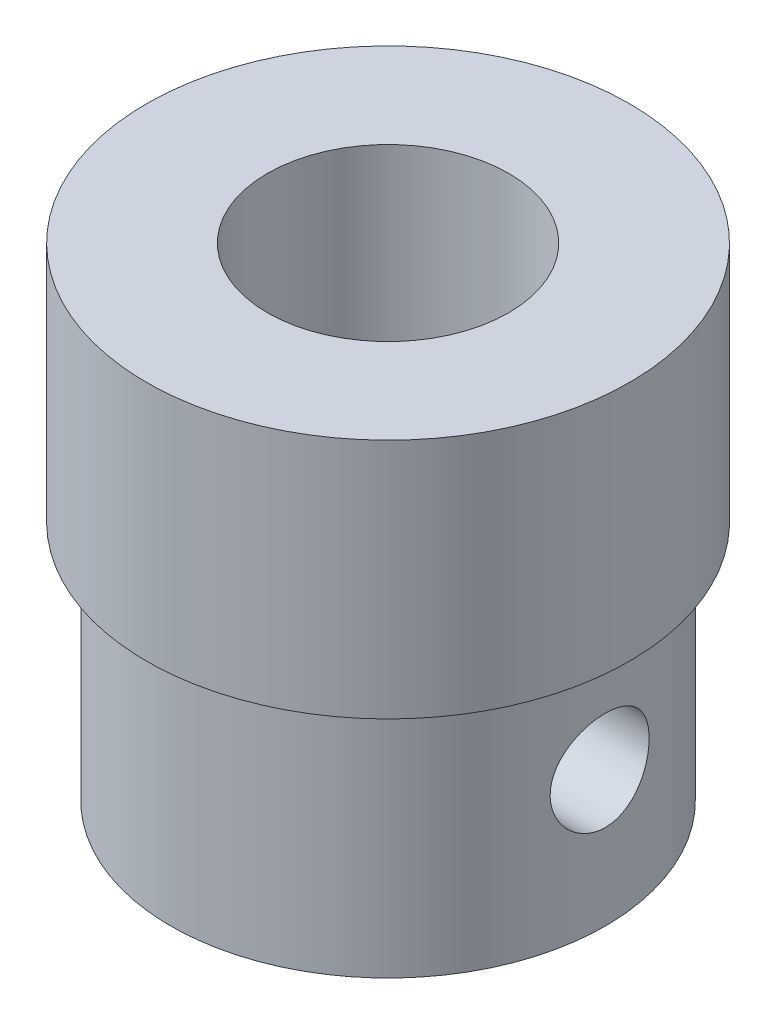
ISO-10303-21;
HEADER;
FILE_DESCRIPTION(('STEP AP214'),'2;1');
FILE_NAME('part.step','',(''),(''),'','','');
FILE_SCHEMA(('AUTOMOTIVE_DESIGN { 1 0 10303 214 1 1 1 1 }'));
ENDSEC;
DATA;
#1=APPLICATION_CONTEXT('core data for automotive mechanical design processes');
#2=APPLICATION_PROTOCOL_DEFINITION('international standard','automotive_design',2000,#1);
#3=PRODUCT_CONTEXT('',#1,'mechanical');
#4=PRODUCT('Part','Part','',(#3));
#5=PRODUCT_RELATED_PRODUCT_CATEGORY('part','',(#4));
#6=PRODUCT_DEFINITION_FORMATION('','',#4);
#7=PRODUCT_DEFINITION_CONTEXT('part definition',#1,'design');
#8=PRODUCT_DEFINITION('design','',#6,#7);
#9=PRODUCT_DEFINITION_SHAPE('','',#8);
#10=(LENGTH_UNIT() NAMED_UNIT(*) SI_UNIT(.MILLI.,.METRE.));
#11=(NAMED_UNIT(*) PLANE_ANGLE_UNIT() SI_UNIT($,.RADIAN.));
#12=(NAMED_UNIT(*) SI_UNIT($,.STERADIAN.) SOLID_ANGLE_UNIT());
#13=UNCERTAINTY_MEASURE_WITH_UNIT(LENGTH_MEASURE(1.E-05),#10,'distance_accuracy_value','');
#14=(GEOMETRIC_REPRESENTATION_CONTEXT(3) GLOBAL_UNCERTAINTY_ASSIGNED_CONTEXT((#13)) GLOBAL_UNIT_ASSIGNED_CONTEXT((#10,
#11,#12)) REPRESENTATION_CONTEXT('',''));
#15=CARTESIAN_POINT('',(0.,0.,0.));
#16=DIRECTION('',(0.,0.,1.));
#17=DIRECTION('',(1.,0.,0.));
#18=AXIS2_PLACEMENT_3D('',#15,#16,#17);
#19=CARTESIAN_POINT('',(0.,5.,-5.));
#20=DIRECTION('',(0.,-1.,0.));
#21=DIRECTION('',(0.,0.,-1.));
#22=AXIS2_PLACEMENT_3D('',#19,#20,#21);
#23=PLANE('',#22);
#24=CARTESIAN_POINT('',(0.,5.,0.));
#25=DIRECTION('',(0.,-1.,0.));
#26=DIRECTION('',(0.,0.,-1.));
#27=AXIS2_PLACEMENT_3D('',#24,#25,#26);
#28=CIRCLE('',#27,4.5);
#29=CARTESIAN_POINT('',(0.,5.,-4.5));
#30=VERTEX_POINT('',#29);
#31=EDGE_CURVE('E17',#30,#30,#28,.T.);
#32=ORIENTED_EDGE('',*,*,#31,.F.);
#33=EDGE_LOOP('',(#32));
#34=FACE_BOUND('',#33,.T.);
#35=CARTESIAN_POINT('',(0.,5.,0.));
#36=DIRECTION('',(0.,-1.,0.));
#37=DIRECTION('',(0.,0.,-1.));
#38=AXIS2_PLACEMENT_3D('',#35,#36,#37);
#39=CIRCLE('',#38,5.);
#40=CARTESIAN_POINT('',(0.,5.,-5.));
#41=VERTEX_POINT('',#40);
#42=EDGE_CURVE('E71',#41,#41,#39,.F.);
#43=ORIENTED_EDGE('',*,*,#42,.F.);
#44=EDGE_LOOP('',(#43));
#45=FACE_BOUND('',#44,.T.);
#46=ADVANCED_FACE('F14',(#34,#45),#23,.T.);
#47=CARTESIAN_POINT('',(0.,0.,0.));
#48=DIRECTION('',(0.,-1.,0.));
#49=DIRECTION('',(0.,0.,-1.));
#50=AXIS2_PLACEMENT_3D('',#47,#48,#49);
#51=CYLINDRICAL_SURFACE('',#50,4.5);
#52=ORIENTED_EDGE('',*,*,#31,.T.);
#53=EDGE_LOOP('',(#52));
#54=FACE_BOUND('',#53,.T.);
#55=CARTESIAN_POINT('',(0.,0.,0.));
#56=DIRECTION('',(0.,-1.,0.));
#57=DIRECTION('',(0.,0.,-1.));
#58=AXIS2_PLACEMENT_3D('',#55,#56,#57);
#59=CIRCLE('',#58,4.5);
#60=CARTESIAN_POINT('',(0.,0.,-4.5));
#61=VERTEX_POINT('',#60);
#62=EDGE_CURVE('E41',#61,#61,#59,.T.);
#63=ORIENTED_EDGE('',*,*,#62,.F.);
#64=EDGE_LOOP('',(#63));
#65=FACE_BOUND('',#64,.T.);
#66=CARTESIAN_POINT('',(4.38170914141959,2.794,1.025));
#67=CARTESIAN_POINT('',(4.38171081021251,2.8507048594204,1.02499716521662));
#68=CARTESIAN_POINT('',(4.38282306453252,2.90747832083759,1.0202737538475));
#69=CARTESIAN_POINT('',(4.38714702504882,3.01945444709555,1.00151372569143));
#70=CARTESIAN_POINT('',(4.39036279760166,3.07465385296487,0.987459069683738));
#71=CARTESIAN_POINT('',(4.39851062437885,3.18177417834126,0.950504805352367));
#72=CARTESIAN_POINT('',(4.4034398676232,3.23370030390837,0.927619676855845));
#73=CARTESIAN_POINT('',(4.41445557607396,3.33296207570977,0.873690942130874));
#74=CARTESIAN_POINT('',(4.42054171114553,3.38029902572281,0.842649662407555));
#75=CARTESIAN_POINT('',(4.43331175869483,3.46992991300116,0.772676609648803));
#76=CARTESIAN_POINT('',(4.44000390668166,3.51212726750002,0.733622590136735));
#77=CARTESIAN_POINT('',(4.45316031317156,3.58943470365481,0.648994551231771));
#78=CARTESIAN_POINT('',(4.45962454058601,3.62454382153044,0.603419646638336));
#79=CARTESIAN_POINT('',(4.47168569051379,3.68705782434611,0.506399157513552));
#80=CARTESIAN_POINT('',(4.47727185588944,3.71437006873901,0.454892428453675));
#81=CARTESIAN_POINT('',(4.48685495669005,3.75991450962619,0.347871851835961));
#82=CARTESIAN_POINT('',(4.49085209868947,3.77814788645924,0.29235852624864));
#83=CARTESIAN_POINT('',(4.49674905130106,3.80471412425488,0.179898325002224));
#84=CARTESIAN_POINT('',(4.49868324700852,3.81320948342443,0.122991669620679));
#85=CARTESIAN_POINT('',(4.50035570255476,3.82056714551481,0.00853013347353732));
#86=CARTESIAN_POINT('',(4.50009423084367,3.81943062606334,-0.049024667188228));
#87=CARTESIAN_POINT('',(4.49743090643942,3.80767669403908,-0.16202609599028));
#88=CARTESIAN_POINT('',(4.49506862883358,3.7972345733346,-0.217492028144002));
#89=CARTESIAN_POINT('',(4.48851445323447,3.76744572250604,-0.325863295832664));
#90=CARTESIAN_POINT('',(4.48432245537158,3.74809850632174,-0.378768491422598));
#91=CARTESIAN_POINT('',(4.47451692054439,3.70089664693583,-0.480997313872267));
#92=CARTESIAN_POINT('',(4.46889248744823,3.67297644066494,-0.530289580330382));
#93=CARTESIAN_POINT('',(4.45683754136062,3.60947230313593,-0.623548993628609));
#94=CARTESIAN_POINT('',(4.45040696615854,3.57388778026416,-0.667515728977917));
#95=CARTESIAN_POINT('',(4.43727483677166,3.49512148105353,-0.749916156465478));
#96=CARTESIAN_POINT('',(4.43057043869179,3.45178758416923,-0.788204101351547));
#97=CARTESIAN_POINT('',(4.4177772136514,3.35922352470491,-0.857014372708394));
#98=CARTESIAN_POINT('',(4.41168866033703,3.30999076204805,-0.887533256109256));
#99=CARTESIAN_POINT('',(4.40080720816533,3.20676295556824,-0.94001061615219));
#100=CARTESIAN_POINT('',(4.39601986838745,3.15274874657511,-0.961932535735792));
#101=CARTESIAN_POINT('',(4.38835959144151,3.04173502024411,-0.996300719740639));
#102=CARTESIAN_POINT('',(4.3854826234067,2.98474206408444,-1.00876694355729));
#103=CARTESIAN_POINT('',(4.3830607487834,2.90507921823238,-1.01920754258495));
#104=CARTESIAN_POINT('',(4.38255516971694,2.88292517544516,-1.02137771849898));
#105=CARTESIAN_POINT('',(4.38187903798658,2.83851761382237,-1.02427450560768));
#106=CARTESIAN_POINT('',(4.38170848619949,2.81626409472661,-1.02500111302429));
#107=CARTESIAN_POINT('',(4.38171081021251,2.7372951405796,-1.02499716521662));
#108=CARTESIAN_POINT('',(4.38282306453252,2.68052167916242,-1.0202737538475));
#109=CARTESIAN_POINT('',(4.38714702504882,2.56854555290445,-1.00151372569143));
#110=CARTESIAN_POINT('',(4.39036279760166,2.51334614703514,-0.987459069683738));
#111=CARTESIAN_POINT('',(4.39851062437885,2.40622582165874,-0.950504805352367));
#112=CARTESIAN_POINT('',(4.4034398676232,2.35429969609163,-0.927619676855845));
#113=CARTESIAN_POINT('',(4.41445557607396,2.25503792429023,-0.873690942130874));
#114=CARTESIAN_POINT('',(4.42054171114553,2.20770097427719,-0.842649662407555));
#115=CARTESIAN_POINT('',(4.43331175869483,2.11807008699884,-0.772676609648803));
#116=CARTESIAN_POINT('',(4.44000390668166,2.07587273249998,-0.733622590136735));
#117=CARTESIAN_POINT('',(4.45316031317156,1.99856529634519,-0.64899455123177));
#118=CARTESIAN_POINT('',(4.45962454058601,1.96345617846956,-0.603419646638336));
#119=CARTESIAN_POINT('',(4.47168569051379,1.9009421756539,-0.506399157513553));
#120=CARTESIAN_POINT('',(4.47727185588944,1.87362993126099,-0.454892428453676));
#121=CARTESIAN_POINT('',(4.48685495669005,1.82808549037381,-0.347871851835961));
#122=CARTESIAN_POINT('',(4.49085209868947,1.80985211354077,-0.29235852624864));
#123=CARTESIAN_POINT('',(4.49674905130106,1.78328587574512,-0.179898325002224));
#124=CARTESIAN_POINT('',(4.49868324700852,1.77479051657557,-0.122991669620679));
#125=CARTESIAN_POINT('',(4.50035570255476,1.76743285448519,-0.00853013347353745));
#126=CARTESIAN_POINT('',(4.50009423084367,1.76856937393666,0.0490246671882278));
#127=CARTESIAN_POINT('',(4.49743090643942,1.78032330596092,0.162026095990279));
#128=CARTESIAN_POINT('',(4.49506862883358,1.7907654266654,0.217492028144002));
#129=CARTESIAN_POINT('',(4.48851445323447,1.82055427749396,0.325863295832664));
#130=CARTESIAN_POINT('',(4.48432245537158,1.83990149367826,0.378768491422598));
#131=CARTESIAN_POINT('',(4.47451692054439,1.88710335306417,0.480997313872267));
#132=CARTESIAN_POINT('',(4.46889248744824,1.91502355933506,0.530289580330382));
#133=CARTESIAN_POINT('',(4.45683754136062,1.97852769686407,0.623548993628609));
#134=CARTESIAN_POINT('',(4.45040696615854,2.01411221973584,0.667515728977917));
#135=CARTESIAN_POINT('',(4.43727483677166,2.09287851894647,0.749916156465478));
#136=CARTESIAN_POINT('',(4.43057043869179,2.13621241583077,0.788204101351547));
#137=CARTESIAN_POINT('',(4.4177772136514,2.2287764752951,0.857014372708395));
#138=CARTESIAN_POINT('',(4.41168866033703,2.27800923795195,0.887533256109256));
#139=CARTESIAN_POINT('',(4.40080720816533,2.38123704443176,0.940010616152191));
#140=CARTESIAN_POINT('',(4.39601986838745,2.43525125342489,0.961932535735793));
#141=CARTESIAN_POINT('',(4.38835959144151,2.54626497975589,0.99630071974064));
#142=CARTESIAN_POINT('',(4.3854826234067,2.60325793591556,1.00876694355729));
#143=CARTESIAN_POINT('',(4.3830607487834,2.68292078176762,1.01920754258495));
#144=CARTESIAN_POINT('',(4.38255516971694,2.70507482455484,1.02137771849898));
#145=CARTESIAN_POINT('',(4.38187903798658,2.74948238617763,1.02427450560768));
#146=CARTESIAN_POINT('',(4.38170848619949,2.77173590527339,1.02500111302429));
#147=CARTESIAN_POINT('',(4.38170914141959,2.794,1.025));
#148=B_SPLINE_CURVE_WITH_KNOTS('',3,(#66,#67,#68,#69,#70,#71,#72,#73,#74,#75,#76,#77,#78,#79,
#80,#81,#82,#83,#84,#85,#86,#87,#88,#89,#90,#91,#92,#93,#94,#95,#96,#97,#98,#99,#100,#101,#102,
#103,#104,#105,#106,#107,#108,#109,#110,#111,#112,#113,#114,#115,#116,#117,#118,#119,#120,#121,
#122,#123,#124,#125,#126,#127,#128,#129,#130,#131,#132,#133,#134,#135,#136,#137,#138,#139,#140,
#141,#142,#143,#144,#145,#146,#147),.UNSPECIFIED.,.T.,.F.,(4,2,2,2,2,2,2,2,2,2,2,2,2,2,2,2,2,2,
2,2,2,2,2,2,2,2,2,2,2,2,2,2,2,2,2,2,2,2,2,2,4),(0.,0.170029198031086,0.340388058423636,
0.510468750760364,0.680500980920233,0.853351236094686,1.02622497773759,1.20107455117504,
1.37590138657265,1.54776635811845,1.71961031714573,1.88828407063307,2.05696703180666,
2.22697357831278,2.39699325244206,2.57081561783994,2.74471488373875,2.9193458085028,
3.09360708276612,3.16036566928911,3.22712443053014,3.39715362856123,3.56751248895378,
3.7375931812905,3.90762541145037,4.08047566662483,4.25334940826773,4.42819898170518,
4.60302581710279,4.77489078864859,4.94673474767587,5.11540850116321,5.28409146233679,
5.45409800884291,5.6241176829722,5.79794004837008,5.97183931426889,6.14647023903294,
6.32073151329626,6.38749009981924,6.45424886106028),.UNSPECIFIED.);
#149=CARTESIAN_POINT('',(4.38170914141959,2.794,1.025));
#150=VERTEX_POINT('',#149);
#151=EDGE_CURVE('E74',#150,#150,#148,.T.);
#152=ORIENTED_EDGE('',*,*,#151,.T.);
#153=EDGE_LOOP('',(#152));
#154=FACE_BOUND('',#153,.T.);
#155=ADVANCED_FACE('F65',(#54,#65,#154),#51,.T.);
#156=CARTESIAN_POINT('',(0.,2.794,0.));
#157=DIRECTION('',(-1.,0.,0.));
#158=DIRECTION('',(0.,0.,1.));
#159=AXIS2_PLACEMENT_3D('',#156,#157,#158);
#160=CYLINDRICAL_SURFACE('',#159,1.025);
#161=ORIENTED_EDGE('',*,*,#151,.F.);
#162=EDGE_LOOP('',(#161));
#163=FACE_BOUND('',#162,.T.);
#164=CARTESIAN_POINT('',(2.28021380576474,2.794,1.025));
#165=CARTESIAN_POINT('',(2.28021734117443,2.84882090267112,1.0249966022945));
#166=CARTESIAN_POINT('',(2.28221713965544,2.90368935334572,1.02057895008792));
#167=CARTESIAN_POINT('',(2.28995409267531,3.01180082521586,1.00309350537064));
#168=CARTESIAN_POINT('',(2.29569679981989,3.06504130827609,0.990012860843607));
#169=CARTESIAN_POINT('',(2.31015259120892,3.16820951294035,0.955790678185948));
#170=CARTESIAN_POINT('',(2.31885522463749,3.21814816153101,0.934677470494164));
#171=CARTESIAN_POINT('',(2.33823570690791,3.3137776530631,0.885076374650783));
#172=CARTESIAN_POINT('',(2.34891369248873,3.3594682016109,0.856587975914911));
#173=CARTESIAN_POINT('',(2.37175758574507,3.44805739513323,0.79121837965197));
#174=CARTESIAN_POINT('',(2.38397285424952,3.49066851952645,0.753964630840816));
#175=CARTESIAN_POINT('',(2.40810776232215,3.56924745536197,0.672907249711605));
#176=CARTESIAN_POINT('',(2.42002731169427,3.60521326099458,0.629101646991008));
#177=CARTESIAN_POINT('',(2.44282715517295,3.6709381842992,0.533933229216986));
#178=CARTESIAN_POINT('',(2.45364319069487,3.700375060438,0.482331078043259));
#179=CARTESIAN_POINT('',(2.47241409673673,3.75002672122478,0.37438334753054));
#180=CARTESIAN_POINT('',(2.48037016096173,3.77024535436377,0.318039759336199));
#181=CARTESIAN_POINT('',(2.49217395116597,3.79984834550243,0.205232377435873));
#182=CARTESIAN_POINT('',(2.49620914128836,3.80972902478065,0.148918842494833));
#183=CARTESIAN_POINT('',(2.50039611748621,3.8199771515947,0.0352981265887029));
#184=CARTESIAN_POINT('',(2.50054942244457,3.8203483199609,-0.0220086569603337));
#185=CARTESIAN_POINT('',(2.49706719976685,3.81183177106384,-0.132389306160296));
#186=CARTESIAN_POINT('',(2.49365453760932,3.80348868901508,-0.185513524214173));
#187=CARTESIAN_POINT('',(2.48372760660338,3.77871115283849,-0.289530674662672));
#188=CARTESIAN_POINT('',(2.47721310995046,3.76227610441856,-0.340423442875611));
#189=CARTESIAN_POINT('',(2.46159035720483,3.72158246954287,-0.4394617796609));
#190=CARTESIAN_POINT('',(2.45244414002751,3.69720863696688,-0.487553758932003));
#191=CARTESIAN_POINT('',(2.43245851923637,3.64144095371001,-0.579088642281599));
#192=CARTESIAN_POINT('',(2.4216185839666,3.61004489742225,-0.622530079320848));
#193=CARTESIAN_POINT('',(2.39846237024758,3.53862332395029,-0.706690750736323));
#194=CARTESIAN_POINT('',(2.3860958253889,3.498154328144,-0.747020319452656));
#195=CARTESIAN_POINT('',(2.36183961153944,3.41097810364175,-0.820496538206107));
#196=CARTESIAN_POINT('',(2.34995024755034,3.364266965173,-0.853638651968533));
#197=CARTESIAN_POINT('',(2.32763841794231,3.26408772617264,-0.91276033814342));
#198=CARTESIAN_POINT('',(2.31727415670734,3.21045278699401,-0.938480571034046));
#199=CARTESIAN_POINT('',(2.29988634589373,3.0991227135947,-0.980328657496605));
#200=CARTESIAN_POINT('',(2.29285556854694,3.04143667803035,-0.996477283744434));
#201=CARTESIAN_POINT('',(2.28544529019222,2.95163987639561,-1.01329929688275));
#202=CARTESIAN_POINT('',(2.28349273095804,2.92031013145417,-1.01767934935598));
#203=CARTESIAN_POINT('',(2.28087597653818,2.85732554437492,-1.02353066200092));
#204=CARTESIAN_POINT('',(2.28021176331526,2.82567070679475,-1.02500196289607));
#205=CARTESIAN_POINT('',(2.28021734117443,2.73917909732888,-1.0249966022945));
#206=CARTESIAN_POINT('',(2.28221713965544,2.68431064665428,-1.02057895008792));
#207=CARTESIAN_POINT('',(2.28995409267531,2.57619917478414,-1.00309350537064));
#208=CARTESIAN_POINT('',(2.29569679981989,2.52295869172391,-0.990012860843607));
#209=CARTESIAN_POINT('',(2.31015259120892,2.41979048705965,-0.955790678185948));
#210=CARTESIAN_POINT('',(2.31885522463749,2.36985183846899,-0.934677470494164));
#211=CARTESIAN_POINT('',(2.33823570690791,2.2742223469369,-0.885076374650783));
#212=CARTESIAN_POINT('',(2.34891369248873,2.2285317983891,-0.856587975914911));
#213=CARTESIAN_POINT('',(2.37175758574507,2.13994260486677,-0.79121837965197));
#214=CARTESIAN_POINT('',(2.38397285424952,2.09733148047355,-0.753964630840816));
#215=CARTESIAN_POINT('',(2.40810776232215,2.01875254463803,-0.672907249711604));
#216=CARTESIAN_POINT('',(2.42002731169427,1.98278673900542,-0.629101646991007));
#217=CARTESIAN_POINT('',(2.44282715517295,1.9170618157008,-0.533933229216986));
#218=CARTESIAN_POINT('',(2.45364319069487,1.887624939562,-0.482331078043258));
#219=CARTESIAN_POINT('',(2.47241409673673,1.83797327877522,-0.374383347530539));
#220=CARTESIAN_POINT('',(2.48037016096173,1.81775464563623,-0.318039759336198));
#221=CARTESIAN_POINT('',(2.49217395116597,1.78815165449757,-0.205232377435872));
#222=CARTESIAN_POINT('',(2.49620914128836,1.77827097521935,-0.148918842494832));
#223=CARTESIAN_POINT('',(2.50039611748621,1.7680228484053,-0.0352981265887021));
#224=CARTESIAN_POINT('',(2.50054942244457,1.7676516800391,0.0220086569603344));
#225=CARTESIAN_POINT('',(2.49706719976685,1.77616822893616,0.132389306160297));
#226=CARTESIAN_POINT('',(2.49365453760932,1.78451131098492,0.185513524214173));
#227=CARTESIAN_POINT('',(2.48372760660338,1.80928884716151,0.289530674662673));
#228=CARTESIAN_POINT('',(2.47721310995046,1.82572389558144,0.340423442875612));
#229=CARTESIAN_POINT('',(2.46159035720483,1.86641753045713,0.439461779660901));
#230=CARTESIAN_POINT('',(2.4524441400275,1.89079136303312,0.487553758932004));
#231=CARTESIAN_POINT('',(2.43245851923637,1.94655904629,0.5790886422816));
#232=CARTESIAN_POINT('',(2.4216185839666,1.97795510257775,0.622530079320849));
#233=CARTESIAN_POINT('',(2.39846237024758,2.04937667604971,0.706690750736323));
#234=CARTESIAN_POINT('',(2.3860958253889,2.089845671856,0.747020319452656));
#235=CARTESIAN_POINT('',(2.36183961153944,2.17702189635825,0.820496538206107));
#236=CARTESIAN_POINT('',(2.34995024755034,2.223733034827,0.853638651968533));
#237=CARTESIAN_POINT('',(2.32763841794231,2.32391227382736,0.91276033814342));
#238=CARTESIAN_POINT('',(2.31727415670734,2.37754721300599,0.938480571034046));
#239=CARTESIAN_POINT('',(2.29988634589373,2.48887728640531,0.980328657496605));
#240=CARTESIAN_POINT('',(2.29285556854694,2.54656332196965,0.996477283744434));
#241=CARTESIAN_POINT('',(2.28544529019222,2.63636012360439,1.01329929688275));
#242=CARTESIAN_POINT('',(2.28349273095804,2.66768986854583,1.01767934935598));
#243=CARTESIAN_POINT('',(2.28087597653818,2.73067445562508,1.02353066200092));
#244=CARTESIAN_POINT('',(2.28021176331526,2.76232929320525,1.02500196289607));
#245=CARTESIAN_POINT('',(2.28021380576474,2.794,1.025));
#246=B_SPLINE_CURVE_WITH_KNOTS('',3,(#164,#165,#166,#167,#168,#169,#170,#171,#172,#173,#174,
#175,#176,#177,#178,#179,#180,#181,#182,#183,#184,#185,#186,#187,#188,#189,#190,#191,#192,#193,
#194,#195,#196,#197,#198,#199,#200,#201,#202,#203,#204,#205,#206,#207,#208,#209,#210,#211,#212,
#213,#214,#215,#216,#217,#218,#219,#220,#221,#222,#223,#224,#225,#226,#227,#228,#229,#230,#231,
#232,#233,#234,#235,#236,#237,#238,#239,#240,#241,#242,#243,#244,#245),.UNSPECIFIED.,.T.,.F.,(4,
2,2,2,2,2,2,2,2,2,2,2,2,2,2,2,2,2,2,2,2,2,2,2,2,2,2,2,2,2,2,2,2,2,2,2,2,2,2,2,4),(0.,
0.16433764949509,0.328919650540116,0.492926481193266,0.656944669072553,0.829894449214947,
1.00289634719664,1.18312899373707,1.36328632654444,1.53433028254128,1.70530731235468,
1.8662031356586,2.0271107772747,2.19046697231142,2.35387454804888,2.52846341868117,
2.7031621603274,2.88337966153087,3.06320460182729,3.15814580359001,3.25308567613681,
3.4174233256319,3.58200532667692,3.74601215733007,3.91003034520936,4.08298012535175,
4.25598202333345,4.43621466987387,4.61637200268125,4.78741595867809,4.95839298849149,
5.1192888117954,5.2801964534115,5.44355264844822,5.60696022418569,5.78154909481798,
5.9562478364642,6.13646533766768,6.3162902779641,6.41123147972682,6.50617135227361),.UNSPECIFIED.);
#247=CARTESIAN_POINT('',(2.28021380576474,2.794,1.025));
#248=VERTEX_POINT('',#247);
#249=EDGE_CURVE('E33',#248,#248,#246,.T.);
#250=ORIENTED_EDGE('',*,*,#249,.T.);
#251=EDGE_LOOP('',(#250));
#252=FACE_BOUND('',#251,.T.);
#253=ADVANCED_FACE('F43',(#163,#252),#160,.F.);
#254=CARTESIAN_POINT('',(0.,0.,0.));
#255=DIRECTION('',(0.,-1.,0.));
#256=DIRECTION('',(0.,0.,-1.));
#257=AXIS2_PLACEMENT_3D('',#254,#255,#256);
#258=CYLINDRICAL_SURFACE('',#257,5.);
#259=CARTESIAN_POINT('',(0.,10.,0.));
#260=DIRECTION('',(0.,-1.,0.));
#261=DIRECTION('',(0.,0.,-1.));
#262=AXIS2_PLACEMENT_3D('',#259,#260,#261);
#263=CIRCLE('',#262,5.);
#264=CARTESIAN_POINT('',(0.,10.,-5.));
#265=VERTEX_POINT('',#264);
#266=EDGE_CURVE('E28',#265,#265,#263,.F.);
#267=ORIENTED_EDGE('',*,*,#266,.F.);
#268=EDGE_LOOP('',(#267));
#269=FACE_BOUND('',#268,.T.);
#270=ORIENTED_EDGE('',*,*,#42,.T.);
#271=EDGE_LOOP('',(#270));
#272=FACE_BOUND('',#271,.T.);
#273=ADVANCED_FACE('F57',(#269,#272),#258,.T.);
#274=CARTESIAN_POINT('',(0.,0.,-4.5));
#275=DIRECTION('',(0.,-1.,0.));
#276=DIRECTION('',(0.,0.,-1.));
#277=AXIS2_PLACEMENT_3D('',#274,#275,#276);
#278=PLANE('',#277);
#279=CARTESIAN_POINT('',(0.,0.,0.));
#280=DIRECTION('',(0.,-1.,0.));
#281=DIRECTION('',(0.,0.,-1.));
#282=AXIS2_PLACEMENT_3D('',#279,#280,#281);
#283=CIRCLE('',#282,2.50000000000002);
#284=CARTESIAN_POINT('',(0.,0.,-2.50000000000002));
#285=VERTEX_POINT('',#284);
#286=EDGE_CURVE('E22',#285,#285,#283,.F.);
#287=ORIENTED_EDGE('',*,*,#286,.T.);
#288=EDGE_LOOP('',(#287));
#289=FACE_BOUND('',#288,.T.);
#290=ORIENTED_EDGE('',*,*,#62,.T.);
#291=EDGE_LOOP('',(#290));
#292=FACE_BOUND('',#291,.T.);
#293=ADVANCED_FACE('F54',(#289,#292),#278,.T.);
#294=CARTESIAN_POINT('',(0.,10.,-2.5));
#295=DIRECTION('',(0.,1.,0.));
#296=DIRECTION('',(0.,0.,1.));
#297=AXIS2_PLACEMENT_3D('',#294,#295,#296);
#298=PLANE('',#297);
#299=ORIENTED_EDGE('',*,*,#266,.T.);
#300=EDGE_LOOP('',(#299));
#301=FACE_BOUND('',#300,.T.);
#302=CARTESIAN_POINT('',(0.,10.,0.));
#303=DIRECTION('',(0.,-1.,0.));
#304=DIRECTION('',(0.,0.,-1.));
#305=AXIS2_PLACEMENT_3D('',#302,#303,#304);
#306=CIRCLE('',#305,2.50000000000002);
#307=CARTESIAN_POINT('',(0.,10.,-2.50000000000002));
#308=VERTEX_POINT('',#307);
#309=EDGE_CURVE('E10',#308,#308,#306,.T.);
#310=ORIENTED_EDGE('',*,*,#309,.T.);
#311=EDGE_LOOP('',(#310));
#312=FACE_BOUND('',#311,.T.);
#313=ADVANCED_FACE('F50',(#301,#312),#298,.T.);
#314=CARTESIAN_POINT('',(0.,0.,0.));
#315=DIRECTION('',(0.,-1.,0.));
#316=DIRECTION('',(0.,0.,-1.));
#317=AXIS2_PLACEMENT_3D('',#314,#315,#316);
#318=CYLINDRICAL_SURFACE('',#317,2.50000000000002);
#319=ORIENTED_EDGE('',*,*,#286,.F.);
#320=EDGE_LOOP('',(#319));
#321=FACE_BOUND('',#320,.T.);
#322=ORIENTED_EDGE('',*,*,#309,.F.);
#323=EDGE_LOOP('',(#322));
#324=FACE_BOUND('',#323,.T.);
#325=ORIENTED_EDGE('',*,*,#249,.F.);
#326=EDGE_LOOP('',(#325));
#327=FACE_BOUND('',#326,.T.);
#328=ADVANCED_FACE('F46',(#321,#324,#327),#318,.F.);
#329=CLOSED_SHELL('',(#46,#155,#253,#273,#293,#313,#328));
#330=MANIFOLD_SOLID_BREP('B1',#329);
#331=ADVANCED_BREP_SHAPE_REPRESENTATION('',(#18,#330),#14);
#332=SHAPE_DEFINITION_REPRESENTATION(#9,#331);
ENDSEC;
END-ISO-10303-21;
